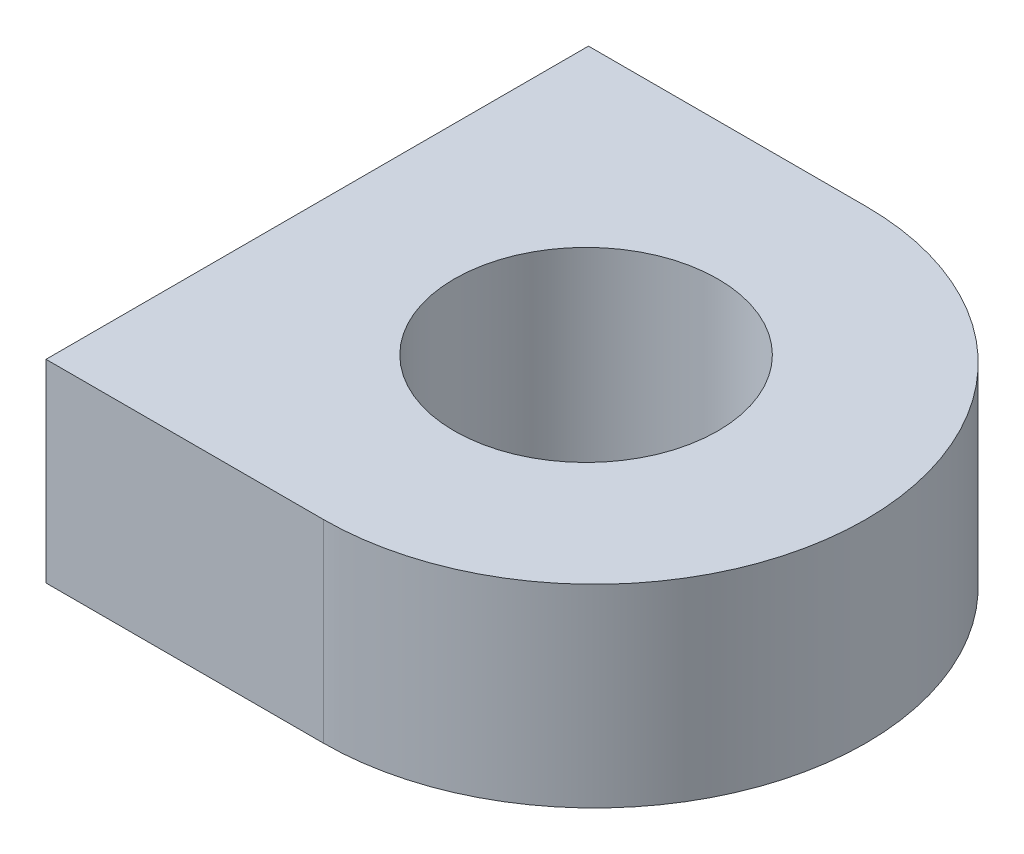
ISO-10303-21;
HEADER;
FILE_DESCRIPTION(('STEP AP214'),'2;1');
FILE_NAME('part.step','',(''),(''),'','','');
FILE_SCHEMA(('AUTOMOTIVE_DESIGN { 1 0 10303 214 1 1 1 1 }'));
ENDSEC;
DATA;
#1=APPLICATION_CONTEXT('core data for automotive mechanical design processes');
#2=APPLICATION_PROTOCOL_DEFINITION('international standard','automotive_design',2000,#1);
#3=PRODUCT_CONTEXT('',#1,'mechanical');
#4=PRODUCT('Part','Part','',(#3));
#5=PRODUCT_RELATED_PRODUCT_CATEGORY('part','',(#4));
#6=PRODUCT_DEFINITION_FORMATION('','',#4);
#7=PRODUCT_DEFINITION_CONTEXT('part definition',#1,'design');
#8=PRODUCT_DEFINITION('design','',#6,#7);
#9=PRODUCT_DEFINITION_SHAPE('','',#8);
#10=(LENGTH_UNIT() NAMED_UNIT(*) SI_UNIT(.MILLI.,.METRE.));
#11=(NAMED_UNIT(*) PLANE_ANGLE_UNIT() SI_UNIT($,.RADIAN.));
#12=(NAMED_UNIT(*) SI_UNIT($,.STERADIAN.) SOLID_ANGLE_UNIT());
#13=UNCERTAINTY_MEASURE_WITH_UNIT(LENGTH_MEASURE(1.E-05),#10,'distance_accuracy_value','');
#14=(GEOMETRIC_REPRESENTATION_CONTEXT(3) GLOBAL_UNCERTAINTY_ASSIGNED_CONTEXT((#13)) GLOBAL_UNIT_ASSIGNED_CONTEXT((#10,
#11,#12)) REPRESENTATION_CONTEXT('',''));
#15=CARTESIAN_POINT('',(0.,0.,0.));
#16=DIRECTION('',(0.,0.,1.));
#17=DIRECTION('',(1.,0.,0.));
#18=AXIS2_PLACEMENT_3D('',#15,#16,#17);
#19=CARTESIAN_POINT('',(0.143666225857325,2.5,0.033363683393497));
#20=DIRECTION('',(0.,-1.,0.));
#21=DIRECTION('',(0.,0.,-1.));
#22=AXIS2_PLACEMENT_3D('',#19,#20,#21);
#23=PLANE('',#22);
#24=DIRECTION('',(0.,0.,1.));
#25=VECTOR('',#24,1.);
#26=CARTESIAN_POINT('',(-3.43579487814067,2.5,0.033363683393497));
#27=LINE('',#26,#25);
#28=CARTESIAN_POINT('',(-3.43579487814067,2.5,-3.4666363166065));
#29=VERTEX_POINT('',#28);
#30=CARTESIAN_POINT('',(-3.43579487814067,2.5,3.5333636833935));
#31=VERTEX_POINT('',#30);
#32=EDGE_CURVE('E57',#29,#31,#27,.T.);
#33=ORIENTED_EDGE('',*,*,#32,.T.);
#34=DIRECTION('',(1.,0.,0.));
#35=VECTOR('',#34,1.);
#36=CARTESIAN_POINT('',(-3.43579487814067,2.5,3.5333636833935));
#37=LINE('',#36,#35);
#38=CARTESIAN_POINT('',(0.143666225857325,2.5,3.5333636833935));
#39=VERTEX_POINT('',#38);
#40=EDGE_CURVE('E88',#31,#39,#37,.T.);
#41=ORIENTED_EDGE('',*,*,#40,.T.);
#42=CARTESIAN_POINT('',(0.143666225857325,2.5,0.033363683393497));
#43=DIRECTION('',(0.,1.,0.));
#44=DIRECTION('',(0.,0.,-1.));
#45=AXIS2_PLACEMENT_3D('',#42,#43,#44);
#46=CIRCLE('',#45,3.5);
#47=CARTESIAN_POINT('',(0.143666225857325,2.5,-3.4666363166065));
#48=VERTEX_POINT('',#47);
#49=EDGE_CURVE('E92',#39,#48,#46,.T.);
#50=ORIENTED_EDGE('',*,*,#49,.T.);
#51=DIRECTION('',(-1.,0.,0.));
#52=VECTOR('',#51,1.);
#53=CARTESIAN_POINT('',(-3.43579487814067,2.5,-3.4666363166065));
#54=LINE('',#53,#52);
#55=EDGE_CURVE('E102',#48,#29,#54,.T.);
#56=ORIENTED_EDGE('',*,*,#55,.T.);
#57=EDGE_LOOP('',(#33,#41,#50,#56));
#58=FACE_BOUND('',#57,.T.);
#59=CARTESIAN_POINT('',(0.,2.5,0.));
#60=DIRECTION('',(0.,1.,0.));
#61=DIRECTION('',(0.,0.,1.));
#62=AXIS2_PLACEMENT_3D('',#59,#60,#61);
#63=CIRCLE('',#62,1.7);
#64=CARTESIAN_POINT('',(0.,2.5,1.7));
#65=VERTEX_POINT('',#64);
#66=EDGE_CURVE('E111',#65,#65,#63,.T.);
#67=ORIENTED_EDGE('',*,*,#66,.F.);
#68=EDGE_LOOP('',(#67));
#69=FACE_BOUND('',#68,.T.);
#70=ADVANCED_FACE('F39',(#58,#69),#23,.F.);
#71=CARTESIAN_POINT('',(0.143666225857325,0.,0.033363683393497));
#72=DIRECTION('',(0.,-1.,0.));
#73=DIRECTION('',(0.,0.,-1.));
#74=AXIS2_PLACEMENT_3D('',#71,#72,#73);
#75=PLANE('',#74);
#76=DIRECTION('',(1.,0.,0.));
#77=VECTOR('',#76,1.);
#78=CARTESIAN_POINT('',(-3.43579487814067,0.,3.5333636833935));
#79=LINE('',#78,#77);
#80=CARTESIAN_POINT('',(-3.43579487814067,0.,3.5333636833935));
#81=VERTEX_POINT('',#80);
#82=CARTESIAN_POINT('',(0.143666225857325,0.,3.5333636833935));
#83=VERTEX_POINT('',#82);
#84=EDGE_CURVE('E96',#81,#83,#79,.T.);
#85=ORIENTED_EDGE('',*,*,#84,.F.);
#86=DIRECTION('',(0.,0.,1.));
#87=VECTOR('',#86,1.);
#88=CARTESIAN_POINT('',(-3.43579487814067,0.,0.033363683393497));
#89=LINE('',#88,#87);
#90=CARTESIAN_POINT('',(-3.43579487814067,0.,-3.4666363166065));
#91=VERTEX_POINT('',#90);
#92=EDGE_CURVE('E116',#91,#81,#89,.T.);
#93=ORIENTED_EDGE('',*,*,#92,.F.);
#94=DIRECTION('',(-1.,0.,0.));
#95=VECTOR('',#94,1.);
#96=CARTESIAN_POINT('',(-3.43579487814067,0.,-3.4666363166065));
#97=LINE('',#96,#95);
#98=CARTESIAN_POINT('',(0.143666225857325,0.,-3.4666363166065));
#99=VERTEX_POINT('',#98);
#100=EDGE_CURVE('E82',#99,#91,#97,.T.);
#101=ORIENTED_EDGE('',*,*,#100,.F.);
#102=CARTESIAN_POINT('',(0.143666225857325,0.,0.033363683393497));
#103=DIRECTION('',(0.,1.,0.));
#104=DIRECTION('',(0.,0.,-1.));
#105=AXIS2_PLACEMENT_3D('',#102,#103,#104);
#106=CIRCLE('',#105,3.5);
#107=EDGE_CURVE('E75',#83,#99,#106,.T.);
#108=ORIENTED_EDGE('',*,*,#107,.F.);
#109=EDGE_LOOP('',(#85,#93,#101,#108));
#110=FACE_BOUND('',#109,.T.);
#111=CARTESIAN_POINT('',(0.,0.,0.));
#112=DIRECTION('',(0.,1.,0.));
#113=DIRECTION('',(0.,0.,1.));
#114=AXIS2_PLACEMENT_3D('',#111,#112,#113);
#115=CIRCLE('',#114,1.7);
#116=CARTESIAN_POINT('',(0.,0.,1.7));
#117=VERTEX_POINT('',#116);
#118=EDGE_CURVE('E192',#117,#117,#115,.T.);
#119=ORIENTED_EDGE('',*,*,#118,.T.);
#120=EDGE_LOOP('',(#119));
#121=FACE_BOUND('',#120,.T.);
#122=ADVANCED_FACE('F125',(#110,#121),#75,.T.);
#123=CARTESIAN_POINT('',(-3.43579487814067,2.5,3.5333636833935));
#124=DIRECTION('',(0.,0.,-1.));
#125=DIRECTION('',(-1.,0.,0.));
#126=AXIS2_PLACEMENT_3D('',#123,#124,#125);
#127=PLANE('',#126);
#128=ORIENTED_EDGE('',*,*,#84,.T.);
#129=DIRECTION('',(0.,-1.,0.));
#130=VECTOR('',#129,1.);
#131=CARTESIAN_POINT('',(0.143666225857325,2.5,3.5333636833935));
#132=LINE('',#131,#130);
#133=EDGE_CURVE('E49',#39,#83,#132,.T.);
#134=ORIENTED_EDGE('',*,*,#133,.F.);
#135=ORIENTED_EDGE('',*,*,#40,.F.);
#136=DIRECTION('',(0.,-1.,0.));
#137=VECTOR('',#136,1.);
#138=CARTESIAN_POINT('',(-3.43579487814067,2.5,3.5333636833935));
#139=LINE('',#138,#137);
#140=EDGE_CURVE('E11',#31,#81,#139,.T.);
#141=ORIENTED_EDGE('',*,*,#140,.T.);
#142=EDGE_LOOP('',(#128,#134,#135,#141));
#143=FACE_BOUND('',#142,.T.);
#144=ADVANCED_FACE('F41',(#143),#127,.F.);
#145=CARTESIAN_POINT('',(0.143666225857325,2.5,0.033363683393497));
#146=DIRECTION('',(0.,-1.,0.));
#147=DIRECTION('',(0.,0.,-1.));
#148=AXIS2_PLACEMENT_3D('',#145,#146,#147);
#149=CYLINDRICAL_SURFACE('',#148,3.5);
#150=ORIENTED_EDGE('',*,*,#107,.T.);
#151=DIRECTION('',(0.,-1.,0.));
#152=VECTOR('',#151,1.);
#153=CARTESIAN_POINT('',(0.143666225857325,2.5,-3.4666363166065));
#154=LINE('',#153,#152);
#155=EDGE_CURVE('E98',#48,#99,#154,.T.);
#156=ORIENTED_EDGE('',*,*,#155,.F.);
#157=ORIENTED_EDGE('',*,*,#49,.F.);
#158=ORIENTED_EDGE('',*,*,#133,.T.);
#159=EDGE_LOOP('',(#150,#156,#157,#158));
#160=FACE_BOUND('',#159,.T.);
#161=ADVANCED_FACE('F99',(#160),#149,.T.);
#162=CARTESIAN_POINT('',(-3.43579487814067,2.5,-3.4666363166065));
#163=DIRECTION('',(0.,0.,1.));
#164=DIRECTION('',(1.,0.,0.));
#165=AXIS2_PLACEMENT_3D('',#162,#163,#164);
#166=PLANE('',#165);
#167=ORIENTED_EDGE('',*,*,#100,.T.);
#168=DIRECTION('',(0.,-1.,0.));
#169=VECTOR('',#168,1.);
#170=CARTESIAN_POINT('',(-3.43579487814067,2.5,-3.4666363166065));
#171=LINE('',#170,#169);
#172=EDGE_CURVE('E105',#29,#91,#171,.T.);
#173=ORIENTED_EDGE('',*,*,#172,.F.);
#174=ORIENTED_EDGE('',*,*,#55,.F.);
#175=ORIENTED_EDGE('',*,*,#155,.T.);
#176=EDGE_LOOP('',(#167,#173,#174,#175));
#177=FACE_BOUND('',#176,.T.);
#178=ADVANCED_FACE('F122',(#177),#166,.F.);
#179=CARTESIAN_POINT('',(-3.43579487814067,2.5,0.033363683393497));
#180=DIRECTION('',(1.,0.,0.));
#181=DIRECTION('',(0.,0.,-1.));
#182=AXIS2_PLACEMENT_3D('',#179,#180,#181);
#183=PLANE('',#182);
#184=ORIENTED_EDGE('',*,*,#92,.T.);
#185=ORIENTED_EDGE('',*,*,#140,.F.);
#186=ORIENTED_EDGE('',*,*,#32,.F.);
#187=ORIENTED_EDGE('',*,*,#172,.T.);
#188=EDGE_LOOP('',(#184,#185,#186,#187));
#189=FACE_BOUND('',#188,.T.);
#190=ADVANCED_FACE('F127',(#189),#183,.F.);
#191=CARTESIAN_POINT('',(0.,2.5,0.));
#192=DIRECTION('',(0.,-1.,0.));
#193=DIRECTION('',(0.,0.,-1.));
#194=AXIS2_PLACEMENT_3D('',#191,#192,#193);
#195=CYLINDRICAL_SURFACE('',#194,1.7);
#196=ORIENTED_EDGE('',*,*,#66,.T.);
#197=EDGE_LOOP('',(#196));
#198=FACE_BOUND('',#197,.T.);
#199=ORIENTED_EDGE('',*,*,#118,.F.);
#200=EDGE_LOOP('',(#199));
#201=FACE_BOUND('',#200,.T.);
#202=ADVANCED_FACE('F129',(#198,#201),#195,.F.);
#203=CLOSED_SHELL('',(#70,#122,#144,#161,#178,#190,#202));
#204=MANIFOLD_SOLID_BREP('B2',#203);
#205=ADVANCED_BREP_SHAPE_REPRESENTATION('',(#18,#204),#14);
#206=SHAPE_DEFINITION_REPRESENTATION(#9,#205);
ENDSEC;
END-ISO-10303-21;
